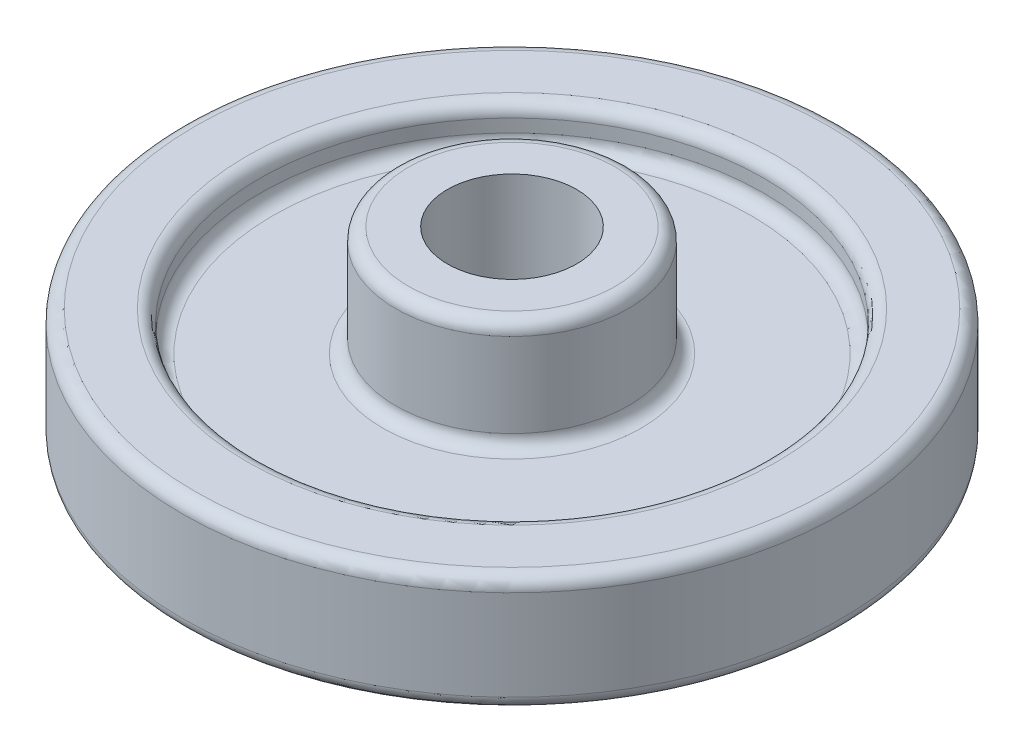
ISO-10303-21;
HEADER;
FILE_DESCRIPTION(('STEP AP214'),'2;1');
FILE_NAME('part.step','',(''),(''),'','','');
FILE_SCHEMA(('AUTOMOTIVE_DESIGN { 1 0 10303 214 1 1 1 1 }'));
ENDSEC;
DATA;
#1=APPLICATION_CONTEXT('core data for automotive mechanical design processes');
#2=APPLICATION_PROTOCOL_DEFINITION('international standard','automotive_design',2000,#1);
#3=PRODUCT_CONTEXT('',#1,'mechanical');
#4=PRODUCT('Part','Part','',(#3));
#5=PRODUCT_RELATED_PRODUCT_CATEGORY('part','',(#4));
#6=PRODUCT_DEFINITION_FORMATION('','',#4);
#7=PRODUCT_DEFINITION_CONTEXT('part definition',#1,'design');
#8=PRODUCT_DEFINITION('design','',#6,#7);
#9=PRODUCT_DEFINITION_SHAPE('','',#8);
#10=(LENGTH_UNIT() NAMED_UNIT(*) SI_UNIT(.MILLI.,.METRE.));
#11=(NAMED_UNIT(*) PLANE_ANGLE_UNIT() SI_UNIT($,.RADIAN.));
#12=(NAMED_UNIT(*) SI_UNIT($,.STERADIAN.) SOLID_ANGLE_UNIT());
#13=UNCERTAINTY_MEASURE_WITH_UNIT(LENGTH_MEASURE(1.E-05),#10,'distance_accuracy_value','');
#14=(GEOMETRIC_REPRESENTATION_CONTEXT(3) GLOBAL_UNCERTAINTY_ASSIGNED_CONTEXT((#13)) GLOBAL_UNIT_ASSIGNED_CONTEXT((#10,
#11,#12)) REPRESENTATION_CONTEXT('',''));
#15=CARTESIAN_POINT('',(0.,0.,0.));
#16=DIRECTION('',(0.,0.,1.));
#17=DIRECTION('',(1.,0.,0.));
#18=AXIS2_PLACEMENT_3D('',#15,#16,#17);
#19=CARTESIAN_POINT('',(28.575,0.,0.));
#20=DIRECTION('',(0.,1.,0.));
#21=DIRECTION('',(0.,0.,1.));
#22=AXIS2_PLACEMENT_3D('',#19,#20,#21);
#23=PLANE('',#22);
#24=CARTESIAN_POINT('',(0.,0.,0.));
#25=DIRECTION('',(0.,-1.,0.));
#26=DIRECTION('',(0.,0.,-1.));
#27=AXIS2_PLACEMENT_3D('',#24,#25,#26);
#28=CIRCLE('',#27,15.875);
#29=CARTESIAN_POINT('',(0.,0.,-15.875));
#30=VERTEX_POINT('',#29);
#31=EDGE_CURVE('E97',#30,#30,#28,.T.);
#32=ORIENTED_EDGE('',*,*,#31,.F.);
#33=EDGE_LOOP('',(#32));
#34=FACE_BOUND('',#33,.T.);
#35=CARTESIAN_POINT('',(0.,0.,0.));
#36=DIRECTION('',(0.,-1.,0.));
#37=DIRECTION('',(0.,0.,-1.));
#38=AXIS2_PLACEMENT_3D('',#35,#36,#37);
#39=CIRCLE('',#38,28.575);
#40=CARTESIAN_POINT('',(0.,0.,-28.575));
#41=VERTEX_POINT('',#40);
#42=EDGE_CURVE('E10',#41,#41,#39,.T.);
#43=ORIENTED_EDGE('',*,*,#42,.T.);
#44=EDGE_LOOP('',(#43));
#45=FACE_BOUND('',#44,.T.);
#46=ADVANCED_FACE('F30',(#34,#45),#23,.F.);
#47=CARTESIAN_POINT('',(0.,0.,0.));
#48=DIRECTION('',(0.,-1.,0.));
#49=DIRECTION('',(0.,0.,-1.));
#50=AXIS2_PLACEMENT_3D('',#47,#48,#49);
#51=CYLINDRICAL_SURFACE('',#50,28.575);
#52=CARTESIAN_POINT('',(0.,6.34999999999999,0.));
#53=DIRECTION('',(0.,-1.,0.));
#54=DIRECTION('',(0.,0.,-1.));
#55=AXIS2_PLACEMENT_3D('',#52,#53,#54);
#56=CIRCLE('',#55,28.575);
#57=CARTESIAN_POINT('',(0.,6.34999999999999,-28.575));
#58=VERTEX_POINT('',#57);
#59=EDGE_CURVE('E36',#58,#58,#56,.T.);
#60=ORIENTED_EDGE('',*,*,#59,.T.);
#61=EDGE_LOOP('',(#60));
#62=FACE_BOUND('',#61,.T.);
#63=ORIENTED_EDGE('',*,*,#42,.F.);
#64=EDGE_LOOP('',(#63));
#65=FACE_BOUND('',#64,.T.);
#66=ADVANCED_FACE('F104',(#62,#65),#51,.T.);
#67=CARTESIAN_POINT('',(0.,6.35000000000001,0.));
#68=DIRECTION('',(0.,-1.,0.));
#69=DIRECTION('',(0.,0.,-1.));
#70=AXIS2_PLACEMENT_3D('',#67,#68,#69);
#71=TOROIDAL_SURFACE('',#70,31.75,3.175);
#72=ORIENTED_EDGE('',*,*,#59,.F.);
#73=EDGE_LOOP('',(#72));
#74=FACE_BOUND('',#73,.T.);
#75=CARTESIAN_POINT('',(0.,9.52500000000001,0.));
#76=DIRECTION('',(0.,-1.,0.));
#77=DIRECTION('',(0.,0.,-1.));
#78=AXIS2_PLACEMENT_3D('',#75,#76,#77);
#79=CIRCLE('',#78,31.75);
#80=CARTESIAN_POINT('',(0.,9.52500000000001,-31.75));
#81=VERTEX_POINT('',#80);
#82=EDGE_CURVE('E40',#81,#81,#79,.T.);
#83=ORIENTED_EDGE('',*,*,#82,.T.);
#84=EDGE_LOOP('',(#83));
#85=FACE_BOUND('',#84,.T.);
#86=ADVANCED_FACE('F108',(#74,#85),#71,.F.);
#87=CARTESIAN_POINT('',(31.75,9.52500000000001,0.));
#88=DIRECTION('',(0.,-1.,0.));
#89=DIRECTION('',(0.,0.,-1.));
#90=AXIS2_PLACEMENT_3D('',#87,#88,#89);
#91=PLANE('',#90);
#92=CARTESIAN_POINT('',(0.,9.52500000000001,0.));
#93=DIRECTION('',(0.,-1.,0.));
#94=DIRECTION('',(0.,0.,-1.));
#95=AXIS2_PLACEMENT_3D('',#92,#93,#94);
#96=CIRCLE('',#95,58.7375);
#97=CARTESIAN_POINT('',(0.,9.52500000000001,-58.7375));
#98=VERTEX_POINT('',#97);
#99=EDGE_CURVE('E44',#98,#98,#96,.T.);
#100=ORIENTED_EDGE('',*,*,#99,.T.);
#101=EDGE_LOOP('',(#100));
#102=FACE_BOUND('',#101,.T.);
#103=ORIENTED_EDGE('',*,*,#82,.F.);
#104=EDGE_LOOP('',(#103));
#105=FACE_BOUND('',#104,.T.);
#106=ADVANCED_FACE('F112',(#102,#105),#91,.T.);
#107=CARTESIAN_POINT('',(0.,6.35000000000001,0.));
#108=DIRECTION('',(0.,-1.,0.));
#109=DIRECTION('',(0.,0.,-1.));
#110=AXIS2_PLACEMENT_3D('',#107,#108,#109);
#111=TOROIDAL_SURFACE('',#110,58.7375,3.175);
#112=ORIENTED_EDGE('',*,*,#99,.F.);
#113=EDGE_LOOP('',(#112));
#114=FACE_BOUND('',#113,.T.);
#115=CARTESIAN_POINT('',(0.,6.34999999999999,0.));
#116=DIRECTION('',(0.,-1.,0.));
#117=DIRECTION('',(0.,0.,-1.));
#118=AXIS2_PLACEMENT_3D('',#115,#116,#117);
#119=CIRCLE('',#118,61.9125);
#120=CARTESIAN_POINT('',(0.,6.34999999999999,-61.9125));
#121=VERTEX_POINT('',#120);
#122=EDGE_CURVE('E49',#121,#121,#119,.T.);
#123=ORIENTED_EDGE('',*,*,#122,.T.);
#124=EDGE_LOOP('',(#123));
#125=FACE_BOUND('',#124,.T.);
#126=ADVANCED_FACE('F119',(#114,#125),#111,.F.);
#127=CARTESIAN_POINT('',(0.,0.,0.));
#128=DIRECTION('',(0.,-1.,0.));
#129=DIRECTION('',(0.,0.,-1.));
#130=AXIS2_PLACEMENT_3D('',#127,#128,#129);
#131=CYLINDRICAL_SURFACE('',#130,61.9125);
#132=CARTESIAN_POINT('',(0.,3.17500000000003,0.));
#133=DIRECTION('',(0.,-1.,0.));
#134=DIRECTION('',(0.,0.,-1.));
#135=AXIS2_PLACEMENT_3D('',#132,#133,#134);
#136=CIRCLE('',#135,61.9125);
#137=CARTESIAN_POINT('',(0.,3.17500000000003,-61.9125));
#138=VERTEX_POINT('',#137);
#139=EDGE_CURVE('E52',#138,#138,#136,.T.);
#140=ORIENTED_EDGE('',*,*,#139,.T.);
#141=EDGE_LOOP('',(#140));
#142=FACE_BOUND('',#141,.T.);
#143=ORIENTED_EDGE('',*,*,#122,.F.);
#144=EDGE_LOOP('',(#143));
#145=FACE_BOUND('',#144,.T.);
#146=ADVANCED_FACE('F123',(#142,#145),#131,.F.);
#147=CARTESIAN_POINT('',(0.,3.175,0.));
#148=DIRECTION('',(0.,-1.,0.));
#149=DIRECTION('',(0.,0.,-1.));
#150=AXIS2_PLACEMENT_3D('',#147,#148,#149);
#151=TOROIDAL_SURFACE('',#150,65.0875,3.175);
#152=ORIENTED_EDGE('',*,*,#139,.F.);
#153=EDGE_LOOP('',(#152));
#154=FACE_BOUND('',#153,.T.);
#155=CARTESIAN_POINT('',(0.,0.,0.));
#156=DIRECTION('',(0.,-1.,0.));
#157=DIRECTION('',(0.,0.,-1.));
#158=AXIS2_PLACEMENT_3D('',#155,#156,#157);
#159=CIRCLE('',#158,65.0875);
#160=CARTESIAN_POINT('',(0.,0.,-65.0875));
#161=VERTEX_POINT('',#160);
#162=EDGE_CURVE('E55',#161,#161,#159,.T.);
#163=ORIENTED_EDGE('',*,*,#162,.T.);
#164=EDGE_LOOP('',(#163));
#165=FACE_BOUND('',#164,.T.);
#166=ADVANCED_FACE('F127',(#154,#165),#151,.T.);
#167=CARTESIAN_POINT('',(77.7875,0.,0.));
#168=DIRECTION('',(0.,1.,0.));
#169=DIRECTION('',(0.,0.,1.));
#170=AXIS2_PLACEMENT_3D('',#167,#168,#169);
#171=PLANE('',#170);
#172=ORIENTED_EDGE('',*,*,#162,.F.);
#173=EDGE_LOOP('',(#172));
#174=FACE_BOUND('',#173,.T.);
#175=CARTESIAN_POINT('',(0.,0.,0.));
#176=DIRECTION('',(0.,-1.,0.));
#177=DIRECTION('',(0.,0.,-1.));
#178=AXIS2_PLACEMENT_3D('',#175,#176,#177);
#179=CIRCLE('',#178,77.7875);
#180=CARTESIAN_POINT('',(0.,0.,-77.7875));
#181=VERTEX_POINT('',#180);
#182=EDGE_CURVE('E58',#181,#181,#179,.T.);
#183=ORIENTED_EDGE('',*,*,#182,.T.);
#184=EDGE_LOOP('',(#183));
#185=FACE_BOUND('',#184,.T.);
#186=ADVANCED_FACE('F131',(#174,#185),#171,.F.);
#187=CARTESIAN_POINT('',(0.,3.175,0.));
#188=DIRECTION('',(0.,-1.,0.));
#189=DIRECTION('',(0.,0.,-1.));
#190=AXIS2_PLACEMENT_3D('',#187,#188,#189);
#191=TOROIDAL_SURFACE('',#190,77.7875,3.175);
#192=CARTESIAN_POINT('',(0.,3.17500000000003,0.));
#193=DIRECTION('',(0.,-1.,0.));
#194=DIRECTION('',(0.,0.,-1.));
#195=AXIS2_PLACEMENT_3D('',#192,#193,#194);
#196=CIRCLE('',#195,80.9625);
#197=CARTESIAN_POINT('',(0.,3.17500000000003,-80.9625));
#198=VERTEX_POINT('',#197);
#199=EDGE_CURVE('E61',#198,#198,#196,.T.);
#200=ORIENTED_EDGE('',*,*,#199,.T.);
#201=EDGE_LOOP('',(#200));
#202=FACE_BOUND('',#201,.T.);
#203=ORIENTED_EDGE('',*,*,#182,.F.);
#204=EDGE_LOOP('',(#203));
#205=FACE_BOUND('',#204,.T.);
#206=ADVANCED_FACE('F135',(#202,#205),#191,.T.);
#207=CARTESIAN_POINT('',(0.,0.,0.));
#208=DIRECTION('',(0.,-1.,0.));
#209=DIRECTION('',(0.,0.,-1.));
#210=AXIS2_PLACEMENT_3D('',#207,#208,#209);
#211=CYLINDRICAL_SURFACE('',#210,80.9625);
#212=ORIENTED_EDGE('',*,*,#199,.F.);
#213=EDGE_LOOP('',(#212));
#214=FACE_BOUND('',#213,.T.);
#215=CARTESIAN_POINT('',(0.,25.4,0.));
#216=DIRECTION('',(0.,-1.,0.));
#217=DIRECTION('',(0.,0.,-1.));
#218=AXIS2_PLACEMENT_3D('',#215,#216,#217);
#219=CIRCLE('',#218,80.9625);
#220=CARTESIAN_POINT('',(0.,25.4,-80.9625));
#221=VERTEX_POINT('',#220);
#222=EDGE_CURVE('E64',#221,#221,#219,.T.);
#223=ORIENTED_EDGE('',*,*,#222,.T.);
#224=EDGE_LOOP('',(#223));
#225=FACE_BOUND('',#224,.T.);
#226=ADVANCED_FACE('F139',(#214,#225),#211,.T.);
#227=CARTESIAN_POINT('',(0.,25.4,0.));
#228=DIRECTION('',(0.,-1.,0.));
#229=DIRECTION('',(0.,0.,-1.));
#230=AXIS2_PLACEMENT_3D('',#227,#228,#229);
#231=TOROIDAL_SURFACE('',#230,77.7875,3.175);
#232=CARTESIAN_POINT('',(0.,28.575,0.));
#233=DIRECTION('',(0.,-1.,0.));
#234=DIRECTION('',(0.,0.,-1.));
#235=AXIS2_PLACEMENT_3D('',#232,#233,#234);
#236=CIRCLE('',#235,77.7875);
#237=CARTESIAN_POINT('',(0.,28.575,-77.7875));
#238=VERTEX_POINT('',#237);
#239=EDGE_CURVE('E67',#238,#238,#236,.T.);
#240=ORIENTED_EDGE('',*,*,#239,.T.);
#241=EDGE_LOOP('',(#240));
#242=FACE_BOUND('',#241,.T.);
#243=ORIENTED_EDGE('',*,*,#222,.F.);
#244=EDGE_LOOP('',(#243));
#245=FACE_BOUND('',#244,.T.);
#246=ADVANCED_FACE('F143',(#242,#245),#231,.T.);
#247=CARTESIAN_POINT('',(65.0875,28.575,0.));
#248=DIRECTION('',(0.,-1.,0.));
#249=DIRECTION('',(0.,0.,-1.));
#250=AXIS2_PLACEMENT_3D('',#247,#248,#249);
#251=PLANE('',#250);
#252=ORIENTED_EDGE('',*,*,#239,.F.);
#253=EDGE_LOOP('',(#252));
#254=FACE_BOUND('',#253,.T.);
#255=CARTESIAN_POINT('',(0.,28.575,0.));
#256=DIRECTION('',(0.,-1.,0.));
#257=DIRECTION('',(0.,0.,-1.));
#258=AXIS2_PLACEMENT_3D('',#255,#256,#257);
#259=CIRCLE('',#258,65.0875);
#260=CARTESIAN_POINT('',(0.,28.575,-65.0875));
#261=VERTEX_POINT('',#260);
#262=EDGE_CURVE('E70',#261,#261,#259,.T.);
#263=ORIENTED_EDGE('',*,*,#262,.T.);
#264=EDGE_LOOP('',(#263));
#265=FACE_BOUND('',#264,.T.);
#266=ADVANCED_FACE('F147',(#254,#265),#251,.F.);
#267=CARTESIAN_POINT('',(0.,25.4,0.));
#268=DIRECTION('',(0.,-1.,0.));
#269=DIRECTION('',(0.,0.,-1.));
#270=AXIS2_PLACEMENT_3D('',#267,#268,#269);
#271=TOROIDAL_SURFACE('',#270,65.0875,3.175);
#272=CARTESIAN_POINT('',(0.,25.4,0.));
#273=DIRECTION('',(0.,-1.,0.));
#274=DIRECTION('',(0.,0.,-1.));
#275=AXIS2_PLACEMENT_3D('',#272,#273,#274);
#276=CIRCLE('',#275,61.9125);
#277=CARTESIAN_POINT('',(0.,25.4,-61.9125));
#278=VERTEX_POINT('',#277);
#279=EDGE_CURVE('E73',#278,#278,#276,.T.);
#280=ORIENTED_EDGE('',*,*,#279,.T.);
#281=EDGE_LOOP('',(#280));
#282=FACE_BOUND('',#281,.T.);
#283=ORIENTED_EDGE('',*,*,#262,.F.);
#284=EDGE_LOOP('',(#283));
#285=FACE_BOUND('',#284,.T.);
#286=ADVANCED_FACE('F151',(#282,#285),#271,.T.);
#287=CARTESIAN_POINT('',(0.,0.,0.));
#288=DIRECTION('',(0.,-1.,0.));
#289=DIRECTION('',(0.,0.,-1.));
#290=AXIS2_PLACEMENT_3D('',#287,#288,#289);
#291=CYLINDRICAL_SURFACE('',#290,61.9125);
#292=ORIENTED_EDGE('',*,*,#279,.F.);
#293=EDGE_LOOP('',(#292));
#294=FACE_BOUND('',#293,.T.);
#295=CARTESIAN_POINT('',(0.,22.225,0.));
#296=DIRECTION('',(0.,-1.,0.));
#297=DIRECTION('',(0.,0.,-1.));
#298=AXIS2_PLACEMENT_3D('',#295,#296,#297);
#299=CIRCLE('',#298,61.9125);
#300=CARTESIAN_POINT('',(0.,22.225,-61.9125));
#301=VERTEX_POINT('',#300);
#302=EDGE_CURVE('E76',#301,#301,#299,.T.);
#303=ORIENTED_EDGE('',*,*,#302,.T.);
#304=EDGE_LOOP('',(#303));
#305=FACE_BOUND('',#304,.T.);
#306=ADVANCED_FACE('F155',(#294,#305),#291,.F.);
#307=CARTESIAN_POINT('',(0.,22.225,0.));
#308=DIRECTION('',(0.,-1.,0.));
#309=DIRECTION('',(0.,0.,-1.));
#310=AXIS2_PLACEMENT_3D('',#307,#308,#309);
#311=TOROIDAL_SURFACE('',#310,58.7375,3.175);
#312=CARTESIAN_POINT('',(0.,19.05,0.));
#313=DIRECTION('',(0.,-1.,0.));
#314=DIRECTION('',(0.,0.,-1.));
#315=AXIS2_PLACEMENT_3D('',#312,#313,#314);
#316=CIRCLE('',#315,58.7375);
#317=CARTESIAN_POINT('',(0.,19.05,-58.7375));
#318=VERTEX_POINT('',#317);
#319=EDGE_CURVE('E79',#318,#318,#316,.T.);
#320=ORIENTED_EDGE('',*,*,#319,.T.);
#321=EDGE_LOOP('',(#320));
#322=FACE_BOUND('',#321,.T.);
#323=ORIENTED_EDGE('',*,*,#302,.F.);
#324=EDGE_LOOP('',(#323));
#325=FACE_BOUND('',#324,.T.);
#326=ADVANCED_FACE('F159',(#322,#325),#311,.F.);
#327=CARTESIAN_POINT('',(31.75,19.05,0.));
#328=DIRECTION('',(0.,-1.,0.));
#329=DIRECTION('',(0.,0.,-1.));
#330=AXIS2_PLACEMENT_3D('',#327,#328,#329);
#331=PLANE('',#330);
#332=ORIENTED_EDGE('',*,*,#319,.F.);
#333=EDGE_LOOP('',(#332));
#334=FACE_BOUND('',#333,.T.);
#335=CARTESIAN_POINT('',(0.,19.05,0.));
#336=DIRECTION('',(0.,-1.,0.));
#337=DIRECTION('',(0.,0.,-1.));
#338=AXIS2_PLACEMENT_3D('',#335,#336,#337);
#339=CIRCLE('',#338,31.75);
#340=CARTESIAN_POINT('',(0.,19.05,-31.75));
#341=VERTEX_POINT('',#340);
#342=EDGE_CURVE('E82',#341,#341,#339,.T.);
#343=ORIENTED_EDGE('',*,*,#342,.T.);
#344=EDGE_LOOP('',(#343));
#345=FACE_BOUND('',#344,.T.);
#346=ADVANCED_FACE('F163',(#334,#345),#331,.F.);
#347=CARTESIAN_POINT('',(0.,22.225,0.));
#348=DIRECTION('',(0.,-1.,0.));
#349=DIRECTION('',(0.,0.,-1.));
#350=AXIS2_PLACEMENT_3D('',#347,#348,#349);
#351=TOROIDAL_SURFACE('',#350,31.75,3.175);
#352=CARTESIAN_POINT('',(0.,22.225,0.));
#353=DIRECTION('',(0.,-1.,0.));
#354=DIRECTION('',(0.,0.,-1.));
#355=AXIS2_PLACEMENT_3D('',#352,#353,#354);
#356=CIRCLE('',#355,28.575);
#357=CARTESIAN_POINT('',(0.,22.225,-28.575));
#358=VERTEX_POINT('',#357);
#359=EDGE_CURVE('E85',#358,#358,#356,.T.);
#360=ORIENTED_EDGE('',*,*,#359,.T.);
#361=EDGE_LOOP('',(#360));
#362=FACE_BOUND('',#361,.T.);
#363=ORIENTED_EDGE('',*,*,#342,.F.);
#364=EDGE_LOOP('',(#363));
#365=FACE_BOUND('',#364,.T.);
#366=ADVANCED_FACE('F167',(#362,#365),#351,.F.);
#367=CARTESIAN_POINT('',(0.,0.,0.));
#368=DIRECTION('',(0.,-1.,0.));
#369=DIRECTION('',(0.,0.,-1.));
#370=AXIS2_PLACEMENT_3D('',#367,#368,#369);
#371=CYLINDRICAL_SURFACE('',#370,28.575);
#372=ORIENTED_EDGE('',*,*,#359,.F.);
#373=EDGE_LOOP('',(#372));
#374=FACE_BOUND('',#373,.T.);
#375=CARTESIAN_POINT('',(0.,42.8752,0.));
#376=DIRECTION('',(0.,-1.,0.));
#377=DIRECTION('',(0.,0.,-1.));
#378=AXIS2_PLACEMENT_3D('',#375,#376,#377);
#379=CIRCLE('',#378,28.575);
#380=CARTESIAN_POINT('',(0.,42.8752,-28.575));
#381=VERTEX_POINT('',#380);
#382=EDGE_CURVE('E88',#381,#381,#379,.T.);
#383=ORIENTED_EDGE('',*,*,#382,.T.);
#384=EDGE_LOOP('',(#383));
#385=FACE_BOUND('',#384,.T.);
#386=ADVANCED_FACE('F171',(#374,#385),#371,.T.);
#387=CARTESIAN_POINT('',(0.,42.8752,0.));
#388=DIRECTION('',(0.,-1.,0.));
#389=DIRECTION('',(0.,0.,-1.));
#390=AXIS2_PLACEMENT_3D('',#387,#388,#389);
#391=TOROIDAL_SURFACE('',#390,25.4,3.175);
#392=CARTESIAN_POINT('',(0.,46.0502,0.));
#393=DIRECTION('',(0.,-1.,0.));
#394=DIRECTION('',(0.,0.,-1.));
#395=AXIS2_PLACEMENT_3D('',#392,#393,#394);
#396=CIRCLE('',#395,25.4);
#397=CARTESIAN_POINT('',(0.,46.0502,-25.4));
#398=VERTEX_POINT('',#397);
#399=EDGE_CURVE('E91',#398,#398,#396,.T.);
#400=ORIENTED_EDGE('',*,*,#399,.T.);
#401=EDGE_LOOP('',(#400));
#402=FACE_BOUND('',#401,.T.);
#403=ORIENTED_EDGE('',*,*,#382,.F.);
#404=EDGE_LOOP('',(#403));
#405=FACE_BOUND('',#404,.T.);
#406=ADVANCED_FACE('F175',(#402,#405),#391,.T.);
#407=CARTESIAN_POINT('',(15.875,46.0502,0.));
#408=DIRECTION('',(0.,-1.,0.));
#409=DIRECTION('',(0.,0.,-1.));
#410=AXIS2_PLACEMENT_3D('',#407,#408,#409);
#411=PLANE('',#410);
#412=ORIENTED_EDGE('',*,*,#399,.F.);
#413=EDGE_LOOP('',(#412));
#414=FACE_BOUND('',#413,.T.);
#415=CARTESIAN_POINT('',(0.,46.0502,0.));
#416=DIRECTION('',(0.,-1.,0.));
#417=DIRECTION('',(0.,0.,-1.));
#418=AXIS2_PLACEMENT_3D('',#415,#416,#417);
#419=CIRCLE('',#418,15.875);
#420=CARTESIAN_POINT('',(0.,46.0502,-15.875));
#421=VERTEX_POINT('',#420);
#422=EDGE_CURVE('E94',#421,#421,#419,.T.);
#423=ORIENTED_EDGE('',*,*,#422,.T.);
#424=EDGE_LOOP('',(#423));
#425=FACE_BOUND('',#424,.T.);
#426=ADVANCED_FACE('F179',(#414,#425),#411,.F.);
#427=CARTESIAN_POINT('',(0.,0.,0.));
#428=DIRECTION('',(0.,-1.,0.));
#429=DIRECTION('',(0.,0.,-1.));
#430=AXIS2_PLACEMENT_3D('',#427,#428,#429);
#431=CYLINDRICAL_SURFACE('',#430,15.875);
#432=ORIENTED_EDGE('',*,*,#422,.F.);
#433=EDGE_LOOP('',(#432));
#434=FACE_BOUND('',#433,.T.);
#435=ORIENTED_EDGE('',*,*,#31,.T.);
#436=EDGE_LOOP('',(#435));
#437=FACE_BOUND('',#436,.T.);
#438=ADVANCED_FACE('F101',(#434,#437),#431,.F.);
#439=CLOSED_SHELL('',(#46,#66,#86,#106,#126,#146,#166,#186,#206,#226,#246,#266,#286,#306,#326,
#346,#366,#386,#406,#426,#438));
#440=MANIFOLD_SOLID_BREP('B2',#439);
#441=ADVANCED_BREP_SHAPE_REPRESENTATION('',(#18,#440),#14);
#442=SHAPE_DEFINITION_REPRESENTATION(#9,#441);
ENDSEC;
END-ISO-10303-21;
